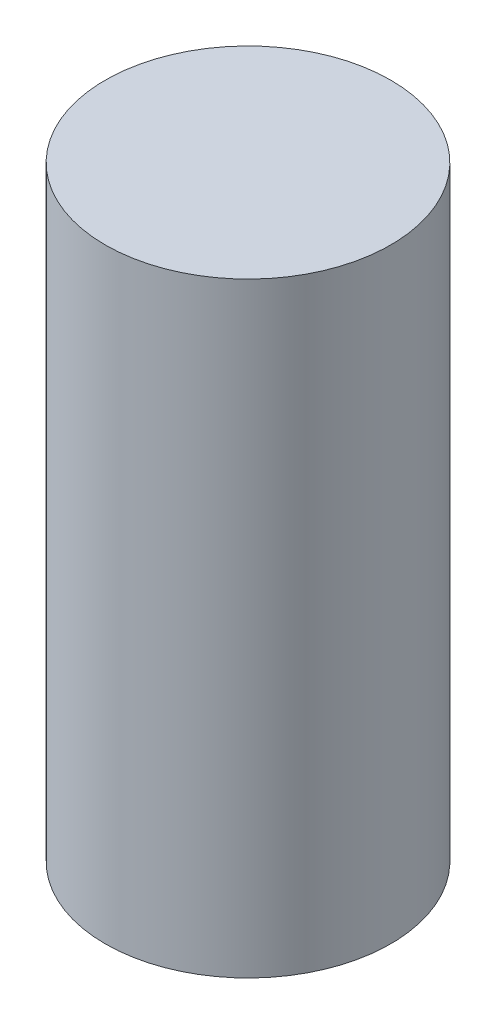
ISO-10303-21;
HEADER;
FILE_DESCRIPTION(('STEP AP214'),'2;1');
FILE_NAME('part.step','',(''),(''),'','','');
FILE_SCHEMA(('AUTOMOTIVE_DESIGN { 1 0 10303 214 1 1 1 1 }'));
ENDSEC;
DATA;
#1=APPLICATION_CONTEXT('core data for automotive mechanical design processes');
#2=APPLICATION_PROTOCOL_DEFINITION('international standard','automotive_design',2000,#1);
#3=PRODUCT_CONTEXT('',#1,'mechanical');
#4=PRODUCT('Part','Part','',(#3));
#5=PRODUCT_RELATED_PRODUCT_CATEGORY('part','',(#4));
#6=PRODUCT_DEFINITION_FORMATION('','',#4);
#7=PRODUCT_DEFINITION_CONTEXT('part definition',#1,'design');
#8=PRODUCT_DEFINITION('design','',#6,#7);
#9=PRODUCT_DEFINITION_SHAPE('','',#8);
#10=(LENGTH_UNIT() NAMED_UNIT(*) SI_UNIT(.MILLI.,.METRE.));
#11=(NAMED_UNIT(*) PLANE_ANGLE_UNIT() SI_UNIT($,.RADIAN.));
#12=(NAMED_UNIT(*) SI_UNIT($,.STERADIAN.) SOLID_ANGLE_UNIT());
#13=UNCERTAINTY_MEASURE_WITH_UNIT(LENGTH_MEASURE(1.E-05),#10,'distance_accuracy_value','');
#14=(GEOMETRIC_REPRESENTATION_CONTEXT(3) GLOBAL_UNCERTAINTY_ASSIGNED_CONTEXT((#13)) GLOBAL_UNIT_ASSIGNED_CONTEXT((#10,
#11,#12)) REPRESENTATION_CONTEXT('',''));
#15=CARTESIAN_POINT('',(0.,0.,0.));
#16=DIRECTION('',(0.,0.,1.));
#17=DIRECTION('',(1.,0.,0.));
#18=AXIS2_PLACEMENT_3D('',#15,#16,#17);
#19=CARTESIAN_POINT('',(0.,269.24,0.));
#20=DIRECTION('',(0.,-1.,0.));
#21=DIRECTION('',(0.,0.,-1.));
#22=AXIS2_PLACEMENT_3D('',#19,#20,#21);
#23=CYLINDRICAL_SURFACE('',#22,63.5);
#24=CARTESIAN_POINT('',(0.,269.24,0.));
#25=DIRECTION('',(0.,1.,0.));
#26=DIRECTION('',(0.,0.,1.));
#27=AXIS2_PLACEMENT_3D('',#24,#25,#26);
#28=CIRCLE('',#27,63.5);
#29=CARTESIAN_POINT('',(0.,269.24,63.5));
#30=VERTEX_POINT('',#29);
#31=EDGE_CURVE('E10',#30,#30,#28,.T.);
#32=ORIENTED_EDGE('',*,*,#31,.F.);
#33=EDGE_LOOP('',(#32));
#34=FACE_BOUND('',#33,.T.);
#35=CARTESIAN_POINT('',(0.,0.,0.));
#36=DIRECTION('',(0.,1.,0.));
#37=DIRECTION('',(0.,0.,1.));
#38=AXIS2_PLACEMENT_3D('',#35,#36,#37);
#39=CIRCLE('',#38,63.5);
#40=CARTESIAN_POINT('',(0.,0.,63.5));
#41=VERTEX_POINT('',#40);
#42=EDGE_CURVE('E44',#41,#41,#39,.T.);
#43=ORIENTED_EDGE('',*,*,#42,.T.);
#44=EDGE_LOOP('',(#43));
#45=FACE_BOUND('',#44,.T.);
#46=ADVANCED_FACE('F41',(#34,#45),#23,.T.);
#47=CARTESIAN_POINT('',(0.,269.24,0.));
#48=DIRECTION('',(0.,1.,0.));
#49=DIRECTION('',(0.,0.,1.));
#50=AXIS2_PLACEMENT_3D('',#47,#48,#49);
#51=PLANE('',#50);
#52=ORIENTED_EDGE('',*,*,#31,.T.);
#53=EDGE_LOOP('',(#52));
#54=FACE_BOUND('',#53,.T.);
#55=ADVANCED_FACE('F56',(#54),#51,.T.);
#56=CARTESIAN_POINT('',(0.,0.,0.));
#57=DIRECTION('',(0.,1.,0.));
#58=DIRECTION('',(0.,0.,1.));
#59=AXIS2_PLACEMENT_3D('',#56,#57,#58);
#60=PLANE('',#59);
#61=ORIENTED_EDGE('',*,*,#42,.F.);
#62=EDGE_LOOP('',(#61));
#63=FACE_BOUND('',#62,.T.);
#64=ADVANCED_FACE('F54',(#63),#60,.F.);
#65=CLOSED_SHELL('',(#46,#55,#64));
#66=MANIFOLD_SOLID_BREP('B2',#65);
#67=ADVANCED_BREP_SHAPE_REPRESENTATION('',(#18,#66),#14);
#68=SHAPE_DEFINITION_REPRESENTATION(#9,#67);
ENDSEC;
END-ISO-10303-21;
